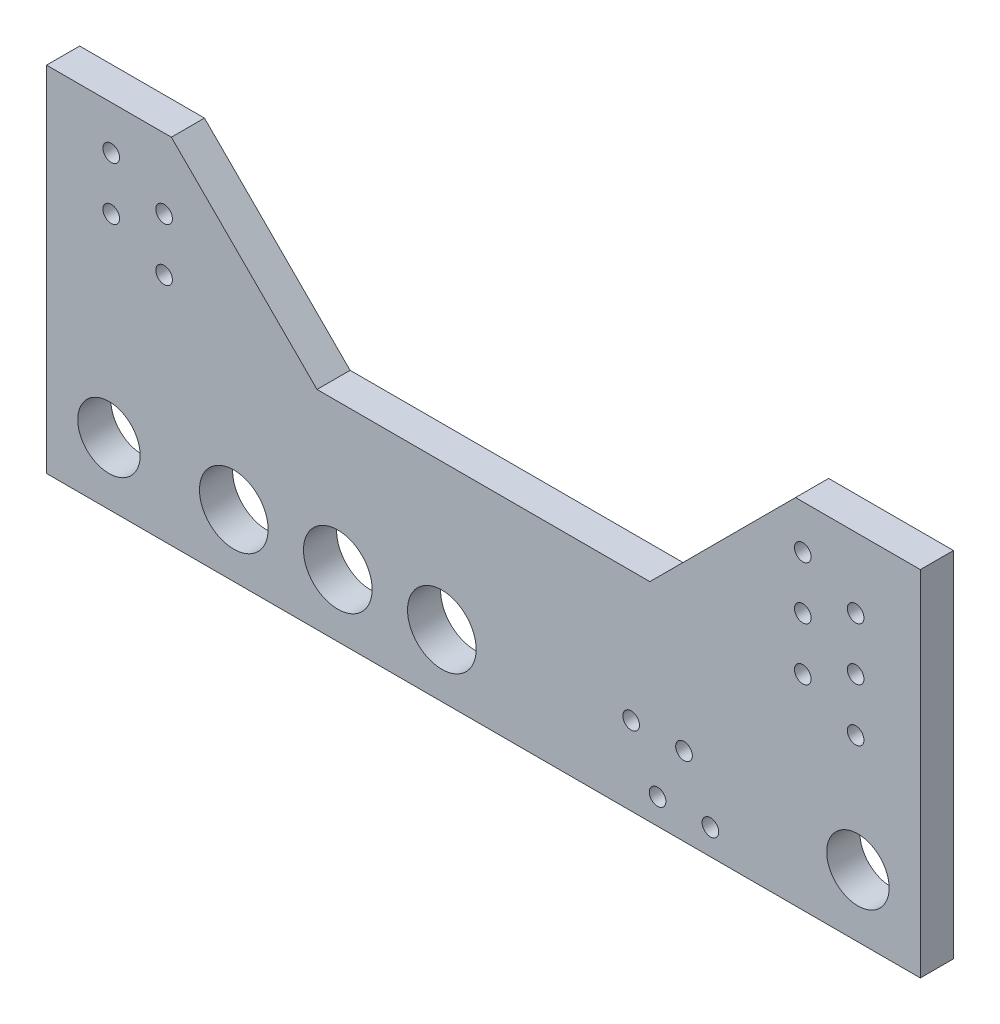
ISO-10303-21;
HEADER;
FILE_DESCRIPTION(('STEP AP214'),'2;1');
FILE_NAME('part.step','',(''),(''),'','','');
FILE_SCHEMA(('AUTOMOTIVE_DESIGN { 1 0 10303 214 1 1 1 1 }'));
ENDSEC;
DATA;
#1=APPLICATION_CONTEXT('core data for automotive mechanical design processes');
#2=APPLICATION_PROTOCOL_DEFINITION('international standard','automotive_design',2000,#1);
#3=PRODUCT_CONTEXT('',#1,'mechanical');
#4=PRODUCT('Part','Part','',(#3));
#5=PRODUCT_RELATED_PRODUCT_CATEGORY('part','',(#4));
#6=PRODUCT_DEFINITION_FORMATION('','',#4);
#7=PRODUCT_DEFINITION_CONTEXT('part definition',#1,'design');
#8=PRODUCT_DEFINITION('design','',#6,#7);
#9=PRODUCT_DEFINITION_SHAPE('','',#8);
#10=(LENGTH_UNIT() NAMED_UNIT(*) SI_UNIT(.MILLI.,.METRE.));
#11=(NAMED_UNIT(*) PLANE_ANGLE_UNIT() SI_UNIT($,.RADIAN.));
#12=(NAMED_UNIT(*) SI_UNIT($,.STERADIAN.) SOLID_ANGLE_UNIT());
#13=UNCERTAINTY_MEASURE_WITH_UNIT(LENGTH_MEASURE(1.E-05),#10,'distance_accuracy_value','');
#14=(GEOMETRIC_REPRESENTATION_CONTEXT(3) GLOBAL_UNCERTAINTY_ASSIGNED_CONTEXT((#13)) GLOBAL_UNIT_ASSIGNED_CONTEXT((#10,
#11,#12)) REPRESENTATION_CONTEXT('',''));
#15=CARTESIAN_POINT('',(0.,0.,0.));
#16=DIRECTION('',(0.,0.,1.));
#17=DIRECTION('',(1.,0.,0.));
#18=AXIS2_PLACEMENT_3D('',#15,#16,#17);
#19=CARTESIAN_POINT('',(0.,0.,-1.59143954));
#20=DIRECTION('',(-1.,0.,0.));
#21=DIRECTION('',(0.,1.,0.));
#22=AXIS2_PLACEMENT_3D('',#19,#20,#21);
#23=PLANE('',#22);
#24=DIRECTION('',(0.,0.,1.));
#25=VECTOR('',#24,1.);
#26=CARTESIAN_POINT('',(0.,0.,-1.59143954));
#27=LINE('',#26,#25);
#28=CARTESIAN_POINT('',(0.,0.,-1.59143954));
#29=VERTEX_POINT('',#28);
#30=CARTESIAN_POINT('',(0.,0.,0.));
#31=VERTEX_POINT('',#30);
#32=EDGE_CURVE('E12',#29,#31,#27,.T.);
#33=ORIENTED_EDGE('',*,*,#32,.T.);
#34=DIRECTION('',(0.,1.,0.));
#35=VECTOR('',#34,1.);
#36=CARTESIAN_POINT('',(0.,0.,0.));
#37=LINE('',#36,#35);
#38=CARTESIAN_POINT('',(0.,17.,0.));
#39=VERTEX_POINT('',#38);
#40=EDGE_CURVE('E27',#31,#39,#37,.T.);
#41=ORIENTED_EDGE('',*,*,#40,.T.);
#42=DIRECTION('',(0.,0.,1.));
#43=VECTOR('',#42,1.);
#44=CARTESIAN_POINT('',(0.,17.,-1.59143954));
#45=LINE('',#44,#43);
#46=CARTESIAN_POINT('',(0.,17.,-1.59143954));
#47=VERTEX_POINT('',#46);
#48=EDGE_CURVE('E317',#47,#39,#45,.T.);
#49=ORIENTED_EDGE('',*,*,#48,.F.);
#50=DIRECTION('',(0.,1.,0.));
#51=VECTOR('',#50,1.);
#52=CARTESIAN_POINT('',(0.,0.,-1.59143954));
#53=LINE('',#52,#51);
#54=EDGE_CURVE('E314',#29,#47,#53,.T.);
#55=ORIENTED_EDGE('',*,*,#54,.F.);
#56=EDGE_LOOP('',(#33,#41,#49,#55));
#57=FACE_BOUND('',#56,.T.);
#58=ADVANCED_FACE('F20',(#57),#23,.T.);
#59=CARTESIAN_POINT('',(0.,17.,-1.59143954));
#60=DIRECTION('',(0.,1.,0.));
#61=DIRECTION('',(1.,0.,0.));
#62=AXIS2_PLACEMENT_3D('',#59,#60,#61);
#63=PLANE('',#62);
#64=ORIENTED_EDGE('',*,*,#48,.T.);
#65=DIRECTION('',(1.,0.,0.));
#66=VECTOR('',#65,1.);
#67=CARTESIAN_POINT('',(0.,17.,0.));
#68=LINE('',#67,#66);
#69=CARTESIAN_POINT('',(6.,17.,0.));
#70=VERTEX_POINT('',#69);
#71=EDGE_CURVE('E312',#39,#70,#68,.T.);
#72=ORIENTED_EDGE('',*,*,#71,.T.);
#73=DIRECTION('',(0.,0.,1.));
#74=VECTOR('',#73,1.);
#75=CARTESIAN_POINT('',(6.,17.,-1.59143954));
#76=LINE('',#75,#74);
#77=CARTESIAN_POINT('',(6.,17.,-1.59143954));
#78=VERTEX_POINT('',#77);
#79=EDGE_CURVE('E309',#78,#70,#76,.T.);
#80=ORIENTED_EDGE('',*,*,#79,.F.);
#81=DIRECTION('',(1.,0.,0.));
#82=VECTOR('',#81,1.);
#83=CARTESIAN_POINT('',(0.,17.,-1.59143954));
#84=LINE('',#83,#82);
#85=EDGE_CURVE('E306',#47,#78,#84,.T.);
#86=ORIENTED_EDGE('',*,*,#85,.F.);
#87=EDGE_LOOP('',(#64,#72,#80,#86));
#88=FACE_BOUND('',#87,.T.);
#89=ADVANCED_FACE('F324',(#88),#63,.T.);
#90=CARTESIAN_POINT('',(6.,17.,-1.59143954));
#91=DIRECTION('',(0.707106781186548,0.707106781186548,0.));
#92=DIRECTION('',(0.707106781186548,-0.707106781186548,0.));
#93=AXIS2_PLACEMENT_3D('',#90,#91,#92);
#94=PLANE('',#93);
#95=ORIENTED_EDGE('',*,*,#79,.T.);
#96=DIRECTION('',(0.707106781186548,-0.707106781186548,0.));
#97=VECTOR('',#96,1.);
#98=CARTESIAN_POINT('',(6.,17.,0.));
#99=LINE('',#98,#97);
#100=CARTESIAN_POINT('',(13.,10.,0.));
#101=VERTEX_POINT('',#100);
#102=EDGE_CURVE('E304',#70,#101,#99,.T.);
#103=ORIENTED_EDGE('',*,*,#102,.T.);
#104=DIRECTION('',(0.,0.,1.));
#105=VECTOR('',#104,1.);
#106=CARTESIAN_POINT('',(13.,10.,-1.59143954));
#107=LINE('',#106,#105);
#108=CARTESIAN_POINT('',(13.,10.,-1.59143954));
#109=VERTEX_POINT('',#108);
#110=EDGE_CURVE('E301',#109,#101,#107,.T.);
#111=ORIENTED_EDGE('',*,*,#110,.F.);
#112=DIRECTION('',(0.707106781186548,-0.707106781186548,0.));
#113=VECTOR('',#112,1.);
#114=CARTESIAN_POINT('',(6.,17.,-1.59143954));
#115=LINE('',#114,#113);
#116=EDGE_CURVE('E298',#78,#109,#115,.T.);
#117=ORIENTED_EDGE('',*,*,#116,.F.);
#118=EDGE_LOOP('',(#95,#103,#111,#117));
#119=FACE_BOUND('',#118,.T.);
#120=ADVANCED_FACE('F331',(#119),#94,.T.);
#121=CARTESIAN_POINT('',(13.,10.,-1.59143954));
#122=DIRECTION('',(0.,1.,0.));
#123=DIRECTION('',(1.,0.,0.));
#124=AXIS2_PLACEMENT_3D('',#121,#122,#123);
#125=PLANE('',#124);
#126=ORIENTED_EDGE('',*,*,#110,.T.);
#127=DIRECTION('',(1.,0.,0.));
#128=VECTOR('',#127,1.);
#129=CARTESIAN_POINT('',(13.,10.,0.));
#130=LINE('',#129,#128);
#131=CARTESIAN_POINT('',(29.,10.,0.));
#132=VERTEX_POINT('',#131);
#133=EDGE_CURVE('E296',#101,#132,#130,.T.);
#134=ORIENTED_EDGE('',*,*,#133,.T.);
#135=DIRECTION('',(0.,0.,1.));
#136=VECTOR('',#135,1.);
#137=CARTESIAN_POINT('',(29.,10.,-1.59143954));
#138=LINE('',#137,#136);
#139=CARTESIAN_POINT('',(29.,10.,-1.59143954));
#140=VERTEX_POINT('',#139);
#141=EDGE_CURVE('E293',#140,#132,#138,.T.);
#142=ORIENTED_EDGE('',*,*,#141,.F.);
#143=DIRECTION('',(1.,0.,0.));
#144=VECTOR('',#143,1.);
#145=CARTESIAN_POINT('',(13.,10.,-1.59143954));
#146=LINE('',#145,#144);
#147=EDGE_CURVE('E290',#109,#140,#146,.T.);
#148=ORIENTED_EDGE('',*,*,#147,.F.);
#149=EDGE_LOOP('',(#126,#134,#142,#148));
#150=FACE_BOUND('',#149,.T.);
#151=ADVANCED_FACE('F335',(#150),#125,.T.);
#152=CARTESIAN_POINT('',(29.,10.,-1.59143954));
#153=DIRECTION('',(-0.707106781186548,0.707106781186548,0.));
#154=DIRECTION('',(0.707106781186548,0.707106781186548,0.));
#155=AXIS2_PLACEMENT_3D('',#152,#153,#154);
#156=PLANE('',#155);
#157=ORIENTED_EDGE('',*,*,#141,.T.);
#158=DIRECTION('',(0.707106781186548,0.707106781186548,0.));
#159=VECTOR('',#158,1.);
#160=CARTESIAN_POINT('',(29.,10.,0.));
#161=LINE('',#160,#159);
#162=CARTESIAN_POINT('',(36.,17.,0.));
#163=VERTEX_POINT('',#162);
#164=EDGE_CURVE('E288',#132,#163,#161,.T.);
#165=ORIENTED_EDGE('',*,*,#164,.T.);
#166=DIRECTION('',(0.,0.,1.));
#167=VECTOR('',#166,1.);
#168=CARTESIAN_POINT('',(36.,17.,-1.59143954));
#169=LINE('',#168,#167);
#170=CARTESIAN_POINT('',(36.,17.,-1.59143954));
#171=VERTEX_POINT('',#170);
#172=EDGE_CURVE('E285',#171,#163,#169,.T.);
#173=ORIENTED_EDGE('',*,*,#172,.F.);
#174=DIRECTION('',(0.707106781186548,0.707106781186548,0.));
#175=VECTOR('',#174,1.);
#176=CARTESIAN_POINT('',(29.,10.,-1.59143954));
#177=LINE('',#176,#175);
#178=EDGE_CURVE('E282',#140,#171,#177,.T.);
#179=ORIENTED_EDGE('',*,*,#178,.F.);
#180=EDGE_LOOP('',(#157,#165,#173,#179));
#181=FACE_BOUND('',#180,.T.);
#182=ADVANCED_FACE('F341',(#181),#156,.T.);
#183=CARTESIAN_POINT('',(36.,17.,-1.59143954));
#184=DIRECTION('',(0.,1.,0.));
#185=DIRECTION('',(1.,0.,0.));
#186=AXIS2_PLACEMENT_3D('',#183,#184,#185);
#187=PLANE('',#186);
#188=ORIENTED_EDGE('',*,*,#172,.T.);
#189=DIRECTION('',(1.,0.,0.));
#190=VECTOR('',#189,1.);
#191=CARTESIAN_POINT('',(36.,17.,0.));
#192=LINE('',#191,#190);
#193=CARTESIAN_POINT('',(42.,17.,0.));
#194=VERTEX_POINT('',#193);
#195=EDGE_CURVE('E280',#163,#194,#192,.T.);
#196=ORIENTED_EDGE('',*,*,#195,.T.);
#197=DIRECTION('',(0.,0.,1.));
#198=VECTOR('',#197,1.);
#199=CARTESIAN_POINT('',(42.,17.,-1.59143954));
#200=LINE('',#199,#198);
#201=CARTESIAN_POINT('',(42.,17.,-1.59143954));
#202=VERTEX_POINT('',#201);
#203=EDGE_CURVE('E277',#202,#194,#200,.T.);
#204=ORIENTED_EDGE('',*,*,#203,.F.);
#205=DIRECTION('',(1.,0.,0.));
#206=VECTOR('',#205,1.);
#207=CARTESIAN_POINT('',(36.,17.,-1.59143954));
#208=LINE('',#207,#206);
#209=EDGE_CURVE('E274',#171,#202,#208,.T.);
#210=ORIENTED_EDGE('',*,*,#209,.F.);
#211=EDGE_LOOP('',(#188,#196,#204,#210));
#212=FACE_BOUND('',#211,.T.);
#213=ADVANCED_FACE('F344',(#212),#187,.T.);
#214=CARTESIAN_POINT('',(42.,17.,-1.59143954));
#215=DIRECTION('',(1.,0.,0.));
#216=DIRECTION('',(0.,-1.,0.));
#217=AXIS2_PLACEMENT_3D('',#214,#215,#216);
#218=PLANE('',#217);
#219=ORIENTED_EDGE('',*,*,#203,.T.);
#220=DIRECTION('',(0.,-1.,0.));
#221=VECTOR('',#220,1.);
#222=CARTESIAN_POINT('',(42.,17.,0.));
#223=LINE('',#222,#221);
#224=CARTESIAN_POINT('',(42.,0.,0.));
#225=VERTEX_POINT('',#224);
#226=EDGE_CURVE('E272',#194,#225,#223,.T.);
#227=ORIENTED_EDGE('',*,*,#226,.T.);
#228=DIRECTION('',(0.,0.,1.));
#229=VECTOR('',#228,1.);
#230=CARTESIAN_POINT('',(42.,0.,-1.59143954));
#231=LINE('',#230,#229);
#232=CARTESIAN_POINT('',(42.,0.,-1.59143954));
#233=VERTEX_POINT('',#232);
#234=EDGE_CURVE('E269',#233,#225,#231,.T.);
#235=ORIENTED_EDGE('',*,*,#234,.F.);
#236=DIRECTION('',(0.,-1.,0.));
#237=VECTOR('',#236,1.);
#238=CARTESIAN_POINT('',(42.,17.,-1.59143954));
#239=LINE('',#238,#237);
#240=EDGE_CURVE('E266',#202,#233,#239,.T.);
#241=ORIENTED_EDGE('',*,*,#240,.F.);
#242=EDGE_LOOP('',(#219,#227,#235,#241));
#243=FACE_BOUND('',#242,.T.);
#244=ADVANCED_FACE('F347',(#243),#218,.T.);
#245=CARTESIAN_POINT('',(42.,0.,-1.59143954));
#246=DIRECTION('',(0.,-1.,0.));
#247=DIRECTION('',(-1.,0.,0.));
#248=AXIS2_PLACEMENT_3D('',#245,#246,#247);
#249=PLANE('',#248);
#250=ORIENTED_EDGE('',*,*,#234,.T.);
#251=DIRECTION('',(-1.,0.,0.));
#252=VECTOR('',#251,1.);
#253=CARTESIAN_POINT('',(42.,0.,0.));
#254=LINE('',#253,#252);
#255=EDGE_CURVE('E264',#225,#31,#254,.T.);
#256=ORIENTED_EDGE('',*,*,#255,.T.);
#257=ORIENTED_EDGE('',*,*,#32,.F.);
#258=DIRECTION('',(-1.,0.,0.));
#259=VECTOR('',#258,1.);
#260=CARTESIAN_POINT('',(42.,0.,-1.59143954));
#261=LINE('',#260,#259);
#262=EDGE_CURVE('E259',#233,#29,#261,.T.);
#263=ORIENTED_EDGE('',*,*,#262,.F.);
#264=EDGE_LOOP('',(#250,#256,#257,#263));
#265=FACE_BOUND('',#264,.T.);
#266=ADVANCED_FACE('F349',(#265),#249,.T.);
#267=CARTESIAN_POINT('',(3.,3.,-1.59143954));
#268=DIRECTION('',(0.,0.,-1.));
#269=DIRECTION('',(1.,0.,0.));
#270=AXIS2_PLACEMENT_3D('',#267,#268,#269);
#271=CYLINDRICAL_SURFACE('',#270,1.5);
#272=DIRECTION('',(0.,0.,1.));
#273=VECTOR('',#272,1.);
#274=CARTESIAN_POINT('',(4.5,3.,-1.59143954));
#275=LINE('',#274,#273);
#276=CARTESIAN_POINT('',(4.5,3.,-1.59143954));
#277=VERTEX_POINT('',#276);
#278=CARTESIAN_POINT('',(4.5,3.,0.));
#279=VERTEX_POINT('',#278);
#280=EDGE_CURVE('E258',#277,#279,#275,.T.);
#281=ORIENTED_EDGE('',*,*,#280,.T.);
#282=CARTESIAN_POINT('',(3.,3.,0.));
#283=DIRECTION('',(0.,0.,1.));
#284=DIRECTION('',(1.,0.,0.));
#285=AXIS2_PLACEMENT_3D('',#282,#283,#284);
#286=CIRCLE('',#285,1.5);
#287=EDGE_CURVE('E253',#279,#279,#286,.T.);
#288=ORIENTED_EDGE('',*,*,#287,.T.);
#289=ORIENTED_EDGE('',*,*,#280,.F.);
#290=CARTESIAN_POINT('',(3.,3.,-1.59143954));
#291=DIRECTION('',(0.,0.,1.));
#292=DIRECTION('',(1.,0.,0.));
#293=AXIS2_PLACEMENT_3D('',#290,#291,#292);
#294=CIRCLE('',#293,1.5);
#295=EDGE_CURVE('E248',#277,#277,#294,.T.);
#296=ORIENTED_EDGE('',*,*,#295,.F.);
#297=EDGE_LOOP('',(#281,#288,#289,#296));
#298=FACE_BOUND('',#297,.T.);
#299=ADVANCED_FACE('F351',(#298),#271,.F.);
#300=CARTESIAN_POINT('',(8.99999978,2.99999908,-1.59143954));
#301=DIRECTION('',(0.,0.,-1.));
#302=DIRECTION('',(1.,0.,0.));
#303=AXIS2_PLACEMENT_3D('',#300,#301,#302);
#304=CYLINDRICAL_SURFACE('',#303,1.64999924);
#305=DIRECTION('',(0.,0.,1.));
#306=VECTOR('',#305,1.);
#307=CARTESIAN_POINT('',(10.64999902,2.99999908,-1.59143954));
#308=LINE('',#307,#306);
#309=CARTESIAN_POINT('',(10.64999902,2.99999908,-1.59143954));
#310=VERTEX_POINT('',#309);
#311=CARTESIAN_POINT('',(10.64999902,2.99999908,0.));
#312=VERTEX_POINT('',#311);
#313=EDGE_CURVE('E254',#310,#312,#308,.T.);
#314=ORIENTED_EDGE('',*,*,#313,.T.);
#315=CARTESIAN_POINT('',(8.99999978,2.99999908,0.));
#316=DIRECTION('',(0.,0.,1.));
#317=DIRECTION('',(1.,0.,0.));
#318=AXIS2_PLACEMENT_3D('',#315,#316,#317);
#319=CIRCLE('',#318,1.64999924);
#320=EDGE_CURVE('E704',#312,#312,#319,.T.);
#321=ORIENTED_EDGE('',*,*,#320,.T.);
#322=ORIENTED_EDGE('',*,*,#313,.F.);
#323=CARTESIAN_POINT('',(8.99999978,2.99999908,-1.59143954));
#324=DIRECTION('',(0.,0.,1.));
#325=DIRECTION('',(1.,0.,0.));
#326=AXIS2_PLACEMENT_3D('',#323,#324,#325);
#327=CIRCLE('',#326,1.64999924);
#328=EDGE_CURVE('E703',#310,#310,#327,.T.);
#329=ORIENTED_EDGE('',*,*,#328,.F.);
#330=EDGE_LOOP('',(#314,#321,#322,#329));
#331=FACE_BOUND('',#330,.T.);
#332=ADVANCED_FACE('F358',(#331),#304,.F.);
#333=CARTESIAN_POINT('',(19.0000001,2.99999908,-1.59143954));
#334=DIRECTION('',(0.,0.,-1.));
#335=DIRECTION('',(1.,0.,0.));
#336=AXIS2_PLACEMENT_3D('',#333,#334,#335);
#337=CYLINDRICAL_SURFACE('',#336,1.64999924);
#338=DIRECTION('',(0.,0.,1.));
#339=VECTOR('',#338,1.);
#340=CARTESIAN_POINT('',(20.64999934,2.99999908,-1.59143954));
#341=LINE('',#340,#339);
#342=CARTESIAN_POINT('',(20.64999934,2.99999908,-1.59143954));
#343=VERTEX_POINT('',#342);
#344=CARTESIAN_POINT('',(20.64999934,2.99999908,0.));
#345=VERTEX_POINT('',#344);
#346=EDGE_CURVE('E701',#343,#345,#341,.T.);
#347=ORIENTED_EDGE('',*,*,#346,.T.);
#348=CARTESIAN_POINT('',(19.0000001,2.99999908,0.));
#349=DIRECTION('',(0.,0.,1.));
#350=DIRECTION('',(1.,0.,0.));
#351=AXIS2_PLACEMENT_3D('',#348,#349,#350);
#352=CIRCLE('',#351,1.64999924);
#353=EDGE_CURVE('E698',#345,#345,#352,.T.);
#354=ORIENTED_EDGE('',*,*,#353,.T.);
#355=ORIENTED_EDGE('',*,*,#346,.F.);
#356=CARTESIAN_POINT('',(19.0000001,2.99999908,-1.59143954));
#357=DIRECTION('',(0.,0.,1.));
#358=DIRECTION('',(1.,0.,0.));
#359=AXIS2_PLACEMENT_3D('',#356,#357,#358);
#360=CIRCLE('',#359,1.64999924);
#361=EDGE_CURVE('E696',#343,#343,#360,.T.);
#362=ORIENTED_EDGE('',*,*,#361,.F.);
#363=EDGE_LOOP('',(#347,#354,#355,#362));
#364=FACE_BOUND('',#363,.T.);
#365=ADVANCED_FACE('F411',(#364),#337,.F.);
#366=CARTESIAN_POINT('',(13.99999994,2.99999908,-1.59143954));
#367=DIRECTION('',(0.,0.,-1.));
#368=DIRECTION('',(1.,0.,0.));
#369=AXIS2_PLACEMENT_3D('',#366,#367,#368);
#370=CYLINDRICAL_SURFACE('',#369,1.64999924);
#371=DIRECTION('',(0.,0.,1.));
#372=VECTOR('',#371,1.);
#373=CARTESIAN_POINT('',(15.64999918,2.99999908,-1.59143954));
#374=LINE('',#373,#372);
#375=CARTESIAN_POINT('',(15.64999918,2.99999908,-1.59143954));
#376=VERTEX_POINT('',#375);
#377=CARTESIAN_POINT('',(15.64999918,2.99999908,0.));
#378=VERTEX_POINT('',#377);
#379=EDGE_CURVE('E694',#376,#378,#374,.T.);
#380=ORIENTED_EDGE('',*,*,#379,.T.);
#381=CARTESIAN_POINT('',(13.99999994,2.99999908,0.));
#382=DIRECTION('',(0.,0.,1.));
#383=DIRECTION('',(1.,0.,0.));
#384=AXIS2_PLACEMENT_3D('',#381,#382,#383);
#385=CIRCLE('',#384,1.64999924);
#386=EDGE_CURVE('E691',#378,#378,#385,.T.);
#387=ORIENTED_EDGE('',*,*,#386,.T.);
#388=ORIENTED_EDGE('',*,*,#379,.F.);
#389=CARTESIAN_POINT('',(13.99999994,2.99999908,-1.59143954));
#390=DIRECTION('',(0.,0.,1.));
#391=DIRECTION('',(1.,0.,0.));
#392=AXIS2_PLACEMENT_3D('',#389,#390,#391);
#393=CIRCLE('',#392,1.64999924);
#394=EDGE_CURVE('E689',#376,#376,#393,.T.);
#395=ORIENTED_EDGE('',*,*,#394,.F.);
#396=EDGE_LOOP('',(#380,#387,#388,#395));
#397=FACE_BOUND('',#396,.T.);
#398=ADVANCED_FACE('F421',(#397),#370,.F.);
#399=CARTESIAN_POINT('',(3.10999886,12.36000068,-1.59143954));
#400=DIRECTION('',(0.,0.,-1.));
#401=DIRECTION('',(1.,0.,0.));
#402=AXIS2_PLACEMENT_3D('',#399,#400,#401);
#403=CYLINDRICAL_SURFACE('',#402,0.3999992);
#404=DIRECTION('',(0.,0.,1.));
#405=VECTOR('',#404,1.);
#406=CARTESIAN_POINT('',(3.50999806,12.36000068,-1.59143954));
#407=LINE('',#406,#405);
#408=CARTESIAN_POINT('',(3.50999806,12.36000068,-1.59143954));
#409=VERTEX_POINT('',#408);
#410=CARTESIAN_POINT('',(3.50999806,12.36000068,0.));
#411=VERTEX_POINT('',#410);
#412=EDGE_CURVE('E687',#409,#411,#407,.T.);
#413=ORIENTED_EDGE('',*,*,#412,.T.);
#414=CARTESIAN_POINT('',(3.10999886,12.36000068,0.));
#415=DIRECTION('',(0.,0.,1.));
#416=DIRECTION('',(1.,0.,0.));
#417=AXIS2_PLACEMENT_3D('',#414,#415,#416);
#418=CIRCLE('',#417,0.3999992);
#419=EDGE_CURVE('E684',#411,#411,#418,.T.);
#420=ORIENTED_EDGE('',*,*,#419,.T.);
#421=ORIENTED_EDGE('',*,*,#412,.F.);
#422=CARTESIAN_POINT('',(3.10999886,12.36000068,-1.59143954));
#423=DIRECTION('',(0.,0.,1.));
#424=DIRECTION('',(1.,0.,0.));
#425=AXIS2_PLACEMENT_3D('',#422,#423,#424);
#426=CIRCLE('',#425,0.3999992);
#427=EDGE_CURVE('E682',#409,#409,#426,.T.);
#428=ORIENTED_EDGE('',*,*,#427,.F.);
#429=EDGE_LOOP('',(#413,#420,#421,#428));
#430=FACE_BOUND('',#429,.T.);
#431=ADVANCED_FACE('F431',(#430),#403,.F.);
#432=CARTESIAN_POINT('',(3.10999886,14.90000068,-1.59143954));
#433=DIRECTION('',(0.,0.,-1.));
#434=DIRECTION('',(1.,0.,0.));
#435=AXIS2_PLACEMENT_3D('',#432,#433,#434);
#436=CYLINDRICAL_SURFACE('',#435,0.3999992);
#437=DIRECTION('',(0.,0.,1.));
#438=VECTOR('',#437,1.);
#439=CARTESIAN_POINT('',(3.50999806,14.90000068,-1.59143954));
#440=LINE('',#439,#438);
#441=CARTESIAN_POINT('',(3.50999806,14.90000068,-1.59143954));
#442=VERTEX_POINT('',#441);
#443=CARTESIAN_POINT('',(3.50999806,14.90000068,0.));
#444=VERTEX_POINT('',#443);
#445=EDGE_CURVE('E680',#442,#444,#440,.T.);
#446=ORIENTED_EDGE('',*,*,#445,.T.);
#447=CARTESIAN_POINT('',(3.10999886,14.90000068,0.));
#448=DIRECTION('',(0.,0.,1.));
#449=DIRECTION('',(1.,0.,0.));
#450=AXIS2_PLACEMENT_3D('',#447,#448,#449);
#451=CIRCLE('',#450,0.3999992);
#452=EDGE_CURVE('E677',#444,#444,#451,.T.);
#453=ORIENTED_EDGE('',*,*,#452,.T.);
#454=ORIENTED_EDGE('',*,*,#445,.F.);
#455=CARTESIAN_POINT('',(3.10999886,14.90000068,-1.59143954));
#456=DIRECTION('',(0.,0.,1.));
#457=DIRECTION('',(1.,0.,0.));
#458=AXIS2_PLACEMENT_3D('',#455,#456,#457);
#459=CIRCLE('',#458,0.3999992);
#460=EDGE_CURVE('E675',#442,#442,#459,.T.);
#461=ORIENTED_EDGE('',*,*,#460,.F.);
#462=EDGE_LOOP('',(#446,#453,#454,#461));
#463=FACE_BOUND('',#462,.T.);
#464=ADVANCED_FACE('F441',(#463),#436,.F.);
#465=CARTESIAN_POINT('',(28.09999968,3.77000008,-1.59143954));
#466=DIRECTION('',(0.,0.,-1.));
#467=DIRECTION('',(1.,0.,0.));
#468=AXIS2_PLACEMENT_3D('',#465,#466,#467);
#469=CYLINDRICAL_SURFACE('',#468,0.3999992);
#470=DIRECTION('',(0.,0.,1.));
#471=VECTOR('',#470,1.);
#472=CARTESIAN_POINT('',(28.49999888,3.77000008,-1.59143954));
#473=LINE('',#472,#471);
#474=CARTESIAN_POINT('',(28.49999888,3.77000008,-1.59143954));
#475=VERTEX_POINT('',#474);
#476=CARTESIAN_POINT('',(28.49999888,3.77000008,0.));
#477=VERTEX_POINT('',#476);
#478=EDGE_CURVE('E673',#475,#477,#473,.T.);
#479=ORIENTED_EDGE('',*,*,#478,.T.);
#480=CARTESIAN_POINT('',(28.09999968,3.77000008,0.));
#481=DIRECTION('',(0.,0.,1.));
#482=DIRECTION('',(1.,0.,0.));
#483=AXIS2_PLACEMENT_3D('',#480,#481,#482);
#484=CIRCLE('',#483,0.3999992);
#485=EDGE_CURVE('E670',#477,#477,#484,.T.);
#486=ORIENTED_EDGE('',*,*,#485,.T.);
#487=ORIENTED_EDGE('',*,*,#478,.F.);
#488=CARTESIAN_POINT('',(28.09999968,3.77000008,-1.59143954));
#489=DIRECTION('',(0.,0.,1.));
#490=DIRECTION('',(1.,0.,0.));
#491=AXIS2_PLACEMENT_3D('',#488,#489,#490);
#492=CIRCLE('',#491,0.3999992);
#493=EDGE_CURVE('E668',#475,#475,#492,.T.);
#494=ORIENTED_EDGE('',*,*,#493,.F.);
#495=EDGE_LOOP('',(#479,#486,#487,#494));
#496=FACE_BOUND('',#495,.T.);
#497=ADVANCED_FACE('F451',(#496),#469,.F.);
#498=CARTESIAN_POINT('',(5.64999886,13.63000068,-1.59143954));
#499=DIRECTION('',(0.,0.,-1.));
#500=DIRECTION('',(1.,0.,0.));
#501=AXIS2_PLACEMENT_3D('',#498,#499,#500);
#502=CYLINDRICAL_SURFACE('',#501,0.3999992);
#503=DIRECTION('',(0.,0.,1.));
#504=VECTOR('',#503,1.);
#505=CARTESIAN_POINT('',(6.04999806,13.63000068,-1.59143954));
#506=LINE('',#505,#504);
#507=CARTESIAN_POINT('',(6.04999806,13.63000068,-1.59143954));
#508=VERTEX_POINT('',#507);
#509=CARTESIAN_POINT('',(6.04999806,13.63000068,0.));
#510=VERTEX_POINT('',#509);
#511=EDGE_CURVE('E666',#508,#510,#506,.T.);
#512=ORIENTED_EDGE('',*,*,#511,.T.);
#513=CARTESIAN_POINT('',(5.64999886,13.63000068,0.));
#514=DIRECTION('',(0.,0.,1.));
#515=DIRECTION('',(1.,0.,0.));
#516=AXIS2_PLACEMENT_3D('',#513,#514,#515);
#517=CIRCLE('',#516,0.3999992);
#518=EDGE_CURVE('E663',#510,#510,#517,.T.);
#519=ORIENTED_EDGE('',*,*,#518,.T.);
#520=ORIENTED_EDGE('',*,*,#511,.F.);
#521=CARTESIAN_POINT('',(5.64999886,13.63000068,-1.59143954));
#522=DIRECTION('',(0.,0.,1.));
#523=DIRECTION('',(1.,0.,0.));
#524=AXIS2_PLACEMENT_3D('',#521,#522,#523);
#525=CIRCLE('',#524,0.3999992);
#526=EDGE_CURVE('E661',#508,#508,#525,.T.);
#527=ORIENTED_EDGE('',*,*,#526,.F.);
#528=EDGE_LOOP('',(#512,#519,#520,#527));
#529=FACE_BOUND('',#528,.T.);
#530=ADVANCED_FACE('F461',(#529),#502,.F.);
#531=CARTESIAN_POINT('',(5.64999886,11.09000068,-1.59143954));
#532=DIRECTION('',(0.,0.,-1.));
#533=DIRECTION('',(1.,0.,0.));
#534=AXIS2_PLACEMENT_3D('',#531,#532,#533);
#535=CYLINDRICAL_SURFACE('',#534,0.3999992);
#536=DIRECTION('',(0.,0.,1.));
#537=VECTOR('',#536,1.);
#538=CARTESIAN_POINT('',(6.04999806,11.09000068,-1.59143954));
#539=LINE('',#538,#537);
#540=CARTESIAN_POINT('',(6.04999806,11.09000068,-1.59143954));
#541=VERTEX_POINT('',#540);
#542=CARTESIAN_POINT('',(6.04999806,11.09000068,0.));
#543=VERTEX_POINT('',#542);
#544=EDGE_CURVE('E659',#541,#543,#539,.T.);
#545=ORIENTED_EDGE('',*,*,#544,.T.);
#546=CARTESIAN_POINT('',(5.64999886,11.09000068,0.));
#547=DIRECTION('',(0.,0.,1.));
#548=DIRECTION('',(1.,0.,0.));
#549=AXIS2_PLACEMENT_3D('',#546,#547,#548);
#550=CIRCLE('',#549,0.3999992);
#551=EDGE_CURVE('E656',#543,#543,#550,.T.);
#552=ORIENTED_EDGE('',*,*,#551,.T.);
#553=ORIENTED_EDGE('',*,*,#544,.F.);
#554=CARTESIAN_POINT('',(5.64999886,11.09000068,-1.59143954));
#555=DIRECTION('',(0.,0.,1.));
#556=DIRECTION('',(1.,0.,0.));
#557=AXIS2_PLACEMENT_3D('',#554,#555,#556);
#558=CIRCLE('',#557,0.3999992);
#559=EDGE_CURVE('E654',#541,#541,#558,.T.);
#560=ORIENTED_EDGE('',*,*,#559,.F.);
#561=EDGE_LOOP('',(#545,#552,#553,#560));
#562=FACE_BOUND('',#561,.T.);
#563=ADVANCED_FACE('F471',(#562),#535,.F.);
#564=CARTESIAN_POINT('',(29.36999968,1.23000008,-1.59143954));
#565=DIRECTION('',(0.,0.,-1.));
#566=DIRECTION('',(1.,0.,0.));
#567=AXIS2_PLACEMENT_3D('',#564,#565,#566);
#568=CYLINDRICAL_SURFACE('',#567,0.3999992);
#569=DIRECTION('',(0.,0.,1.));
#570=VECTOR('',#569,1.);
#571=CARTESIAN_POINT('',(29.76999888,1.23000008,-1.59143954));
#572=LINE('',#571,#570);
#573=CARTESIAN_POINT('',(29.76999888,1.23000008,-1.59143954));
#574=VERTEX_POINT('',#573);
#575=CARTESIAN_POINT('',(29.76999888,1.23000008,0.));
#576=VERTEX_POINT('',#575);
#577=EDGE_CURVE('E652',#574,#576,#572,.T.);
#578=ORIENTED_EDGE('',*,*,#577,.T.);
#579=CARTESIAN_POINT('',(29.36999968,1.23000008,0.));
#580=DIRECTION('',(0.,0.,1.));
#581=DIRECTION('',(1.,0.,0.));
#582=AXIS2_PLACEMENT_3D('',#579,#580,#581);
#583=CIRCLE('',#582,0.3999992);
#584=EDGE_CURVE('E649',#576,#576,#583,.T.);
#585=ORIENTED_EDGE('',*,*,#584,.T.);
#586=ORIENTED_EDGE('',*,*,#577,.F.);
#587=CARTESIAN_POINT('',(29.36999968,1.23000008,-1.59143954));
#588=DIRECTION('',(0.,0.,1.));
#589=DIRECTION('',(1.,0.,0.));
#590=AXIS2_PLACEMENT_3D('',#587,#588,#589);
#591=CIRCLE('',#590,0.3999992);
#592=EDGE_CURVE('E647',#574,#574,#591,.T.);
#593=ORIENTED_EDGE('',*,*,#592,.F.);
#594=EDGE_LOOP('',(#578,#585,#586,#593));
#595=FACE_BOUND('',#594,.T.);
#596=ADVANCED_FACE('F481',(#595),#568,.F.);
#597=CARTESIAN_POINT('',(30.63999968,3.77000008,-1.59143954));
#598=DIRECTION('',(0.,0.,-1.));
#599=DIRECTION('',(1.,0.,0.));
#600=AXIS2_PLACEMENT_3D('',#597,#598,#599);
#601=CYLINDRICAL_SURFACE('',#600,0.3999992);
#602=DIRECTION('',(0.,0.,1.));
#603=VECTOR('',#602,1.);
#604=CARTESIAN_POINT('',(31.03999888,3.77000008,-1.59143954));
#605=LINE('',#604,#603);
#606=CARTESIAN_POINT('',(31.03999888,3.77000008,-1.59143954));
#607=VERTEX_POINT('',#606);
#608=CARTESIAN_POINT('',(31.03999888,3.77000008,0.));
#609=VERTEX_POINT('',#608);
#610=EDGE_CURVE('E645',#607,#609,#605,.T.);
#611=ORIENTED_EDGE('',*,*,#610,.T.);
#612=CARTESIAN_POINT('',(30.63999968,3.77000008,0.));
#613=DIRECTION('',(0.,0.,1.));
#614=DIRECTION('',(1.,0.,0.));
#615=AXIS2_PLACEMENT_3D('',#612,#613,#614);
#616=CIRCLE('',#615,0.3999992);
#617=EDGE_CURVE('E642',#609,#609,#616,.T.);
#618=ORIENTED_EDGE('',*,*,#617,.T.);
#619=ORIENTED_EDGE('',*,*,#610,.F.);
#620=CARTESIAN_POINT('',(30.63999968,3.77000008,-1.59143954));
#621=DIRECTION('',(0.,0.,1.));
#622=DIRECTION('',(1.,0.,0.));
#623=AXIS2_PLACEMENT_3D('',#620,#621,#622);
#624=CIRCLE('',#623,0.3999992);
#625=EDGE_CURVE('E640',#607,#607,#624,.T.);
#626=ORIENTED_EDGE('',*,*,#625,.F.);
#627=EDGE_LOOP('',(#611,#618,#619,#626));
#628=FACE_BOUND('',#627,.T.);
#629=ADVANCED_FACE('F491',(#628),#601,.F.);
#630=CARTESIAN_POINT('',(31.90999968,1.23000008,-1.59143954));
#631=DIRECTION('',(0.,0.,-1.));
#632=DIRECTION('',(1.,0.,0.));
#633=AXIS2_PLACEMENT_3D('',#630,#631,#632);
#634=CYLINDRICAL_SURFACE('',#633,0.3999992);
#635=DIRECTION('',(0.,0.,1.));
#636=VECTOR('',#635,1.);
#637=CARTESIAN_POINT('',(32.30999888,1.23000008,-1.59143954));
#638=LINE('',#637,#636);
#639=CARTESIAN_POINT('',(32.30999888,1.23000008,-1.59143954));
#640=VERTEX_POINT('',#639);
#641=CARTESIAN_POINT('',(32.30999888,1.23000008,0.));
#642=VERTEX_POINT('',#641);
#643=EDGE_CURVE('E638',#640,#642,#638,.T.);
#644=ORIENTED_EDGE('',*,*,#643,.T.);
#645=CARTESIAN_POINT('',(31.90999968,1.23000008,0.));
#646=DIRECTION('',(0.,0.,1.));
#647=DIRECTION('',(1.,0.,0.));
#648=AXIS2_PLACEMENT_3D('',#645,#646,#647);
#649=CIRCLE('',#648,0.3999992);
#650=EDGE_CURVE('E633',#642,#642,#649,.T.);
#651=ORIENTED_EDGE('',*,*,#650,.T.);
#652=ORIENTED_EDGE('',*,*,#643,.F.);
#653=CARTESIAN_POINT('',(31.90999968,1.23000008,-1.59143954));
#654=DIRECTION('',(0.,0.,1.));
#655=DIRECTION('',(1.,0.,0.));
#656=AXIS2_PLACEMENT_3D('',#653,#654,#655);
#657=CIRCLE('',#656,0.3999992);
#658=EDGE_CURVE('E632',#640,#640,#657,.T.);
#659=ORIENTED_EDGE('',*,*,#658,.F.);
#660=EDGE_LOOP('',(#644,#651,#652,#659));
#661=FACE_BOUND('',#660,.T.);
#662=ADVANCED_FACE('F501',(#661),#634,.F.);
#663=CARTESIAN_POINT('',(39.,3.,-1.59143954));
#664=DIRECTION('',(0.,0.,-1.));
#665=DIRECTION('',(1.,0.,0.));
#666=AXIS2_PLACEMENT_3D('',#663,#664,#665);
#667=CYLINDRICAL_SURFACE('',#666,1.5);
#668=DIRECTION('',(0.,0.,1.));
#669=VECTOR('',#668,1.);
#670=CARTESIAN_POINT('',(40.5,3.,-1.59143954));
#671=LINE('',#670,#669);
#672=CARTESIAN_POINT('',(40.5,3.,-1.59143954));
#673=VERTEX_POINT('',#672);
#674=CARTESIAN_POINT('',(40.5,3.,0.));
#675=VERTEX_POINT('',#674);
#676=EDGE_CURVE('E630',#673,#675,#671,.T.);
#677=ORIENTED_EDGE('',*,*,#676,.T.);
#678=CARTESIAN_POINT('',(39.,3.,0.));
#679=DIRECTION('',(0.,0.,1.));
#680=DIRECTION('',(1.,0.,0.));
#681=AXIS2_PLACEMENT_3D('',#678,#679,#680);
#682=CIRCLE('',#681,1.5);
#683=EDGE_CURVE('E244',#675,#675,#682,.T.);
#684=ORIENTED_EDGE('',*,*,#683,.T.);
#685=ORIENTED_EDGE('',*,*,#676,.F.);
#686=CARTESIAN_POINT('',(39.,3.,-1.59143954));
#687=DIRECTION('',(0.,0.,1.));
#688=DIRECTION('',(1.,0.,0.));
#689=AXIS2_PLACEMENT_3D('',#686,#687,#688);
#690=CIRCLE('',#689,1.5);
#691=EDGE_CURVE('E240',#673,#673,#690,.T.);
#692=ORIENTED_EDGE('',*,*,#691,.F.);
#693=EDGE_LOOP('',(#677,#684,#685,#692));
#694=FACE_BOUND('',#693,.T.);
#695=ADVANCED_FACE('F511',(#694),#667,.F.);
#696=CARTESIAN_POINT('',(38.89000096,8.55000068,-1.59143954));
#697=DIRECTION('',(0.,0.,-1.));
#698=DIRECTION('',(1.,0.,0.));
#699=AXIS2_PLACEMENT_3D('',#696,#697,#698);
#700=CYLINDRICAL_SURFACE('',#699,0.3999992);
#701=DIRECTION('',(0.,0.,1.));
#702=VECTOR('',#701,1.);
#703=CARTESIAN_POINT('',(39.29000016,8.55000068,-1.59143954));
#704=LINE('',#703,#702);
#705=CARTESIAN_POINT('',(39.29000016,8.55000068,-1.59143954));
#706=VERTEX_POINT('',#705);
#707=CARTESIAN_POINT('',(39.29000016,8.55000068,0.));
#708=VERTEX_POINT('',#707);
#709=EDGE_CURVE('E238',#706,#708,#704,.T.);
#710=ORIENTED_EDGE('',*,*,#709,.T.);
#711=CARTESIAN_POINT('',(38.89000096,8.55000068,0.));
#712=DIRECTION('',(0.,0.,1.));
#713=DIRECTION('',(1.,0.,0.));
#714=AXIS2_PLACEMENT_3D('',#711,#712,#713);
#715=CIRCLE('',#714,0.3999992);
#716=EDGE_CURVE('E235',#708,#708,#715,.T.);
#717=ORIENTED_EDGE('',*,*,#716,.T.);
#718=ORIENTED_EDGE('',*,*,#709,.F.);
#719=CARTESIAN_POINT('',(38.89000096,8.55000068,-1.59143954));
#720=DIRECTION('',(0.,0.,1.));
#721=DIRECTION('',(1.,0.,0.));
#722=AXIS2_PLACEMENT_3D('',#719,#720,#721);
#723=CIRCLE('',#722,0.3999992);
#724=EDGE_CURVE('E233',#706,#706,#723,.T.);
#725=ORIENTED_EDGE('',*,*,#724,.F.);
#726=EDGE_LOOP('',(#710,#717,#718,#725));
#727=FACE_BOUND('',#726,.T.);
#728=ADVANCED_FACE('F521',(#727),#700,.F.);
#729=CARTESIAN_POINT('',(36.35000096,9.82000068,-1.59143954));
#730=DIRECTION('',(0.,0.,-1.));
#731=DIRECTION('',(1.,0.,0.));
#732=AXIS2_PLACEMENT_3D('',#729,#730,#731);
#733=CYLINDRICAL_SURFACE('',#732,0.3999992);
#734=DIRECTION('',(0.,0.,1.));
#735=VECTOR('',#734,1.);
#736=CARTESIAN_POINT('',(36.75000016,9.82000068,-1.59143954));
#737=LINE('',#736,#735);
#738=CARTESIAN_POINT('',(36.75000016,9.82000068,-1.59143954));
#739=VERTEX_POINT('',#738);
#740=CARTESIAN_POINT('',(36.75000016,9.82000068,0.));
#741=VERTEX_POINT('',#740);
#742=EDGE_CURVE('E231',#739,#741,#737,.T.);
#743=ORIENTED_EDGE('',*,*,#742,.T.);
#744=CARTESIAN_POINT('',(36.35000096,9.82000068,0.));
#745=DIRECTION('',(0.,0.,1.));
#746=DIRECTION('',(1.,0.,0.));
#747=AXIS2_PLACEMENT_3D('',#744,#745,#746);
#748=CIRCLE('',#747,0.3999992);
#749=EDGE_CURVE('E228',#741,#741,#748,.T.);
#750=ORIENTED_EDGE('',*,*,#749,.T.);
#751=ORIENTED_EDGE('',*,*,#742,.F.);
#752=CARTESIAN_POINT('',(36.35000096,9.82000068,-1.59143954));
#753=DIRECTION('',(0.,0.,1.));
#754=DIRECTION('',(1.,0.,0.));
#755=AXIS2_PLACEMENT_3D('',#752,#753,#754);
#756=CIRCLE('',#755,0.3999992);
#757=EDGE_CURVE('E226',#739,#739,#756,.T.);
#758=ORIENTED_EDGE('',*,*,#757,.F.);
#759=EDGE_LOOP('',(#743,#750,#751,#758));
#760=FACE_BOUND('',#759,.T.);
#761=ADVANCED_FACE('F531',(#760),#733,.F.);
#762=CARTESIAN_POINT('',(36.35000096,12.36000068,-1.59143954));
#763=DIRECTION('',(0.,0.,-1.));
#764=DIRECTION('',(1.,0.,0.));
#765=AXIS2_PLACEMENT_3D('',#762,#763,#764);
#766=CYLINDRICAL_SURFACE('',#765,0.3999992);
#767=DIRECTION('',(0.,0.,1.));
#768=VECTOR('',#767,1.);
#769=CARTESIAN_POINT('',(36.75000016,12.36000068,-1.59143954));
#770=LINE('',#769,#768);
#771=CARTESIAN_POINT('',(36.75000016,12.36000068,-1.59143954));
#772=VERTEX_POINT('',#771);
#773=CARTESIAN_POINT('',(36.75000016,12.36000068,0.));
#774=VERTEX_POINT('',#773);
#775=EDGE_CURVE('E224',#772,#774,#770,.T.);
#776=ORIENTED_EDGE('',*,*,#775,.T.);
#777=CARTESIAN_POINT('',(36.35000096,12.36000068,0.));
#778=DIRECTION('',(0.,0.,1.));
#779=DIRECTION('',(1.,0.,0.));
#780=AXIS2_PLACEMENT_3D('',#777,#778,#779);
#781=CIRCLE('',#780,0.3999992);
#782=EDGE_CURVE('E221',#774,#774,#781,.T.);
#783=ORIENTED_EDGE('',*,*,#782,.T.);
#784=ORIENTED_EDGE('',*,*,#775,.F.);
#785=CARTESIAN_POINT('',(36.35000096,12.36000068,-1.59143954));
#786=DIRECTION('',(0.,0.,1.));
#787=DIRECTION('',(1.,0.,0.));
#788=AXIS2_PLACEMENT_3D('',#785,#786,#787);
#789=CIRCLE('',#788,0.3999992);
#790=EDGE_CURVE('E219',#772,#772,#789,.T.);
#791=ORIENTED_EDGE('',*,*,#790,.F.);
#792=EDGE_LOOP('',(#776,#783,#784,#791));
#793=FACE_BOUND('',#792,.T.);
#794=ADVANCED_FACE('F541',(#793),#766,.F.);
#795=CARTESIAN_POINT('',(38.89000096,11.09000068,-1.59143954));
#796=DIRECTION('',(0.,0.,-1.));
#797=DIRECTION('',(1.,0.,0.));
#798=AXIS2_PLACEMENT_3D('',#795,#796,#797);
#799=CYLINDRICAL_SURFACE('',#798,0.3999992);
#800=DIRECTION('',(0.,0.,1.));
#801=VECTOR('',#800,1.);
#802=CARTESIAN_POINT('',(39.29000016,11.09000068,-1.59143954));
#803=LINE('',#802,#801);
#804=CARTESIAN_POINT('',(39.29000016,11.09000068,-1.59143954));
#805=VERTEX_POINT('',#804);
#806=CARTESIAN_POINT('',(39.29000016,11.09000068,0.));
#807=VERTEX_POINT('',#806);
#808=EDGE_CURVE('E217',#805,#807,#803,.T.);
#809=ORIENTED_EDGE('',*,*,#808,.T.);
#810=CARTESIAN_POINT('',(38.89000096,11.09000068,0.));
#811=DIRECTION('',(0.,0.,1.));
#812=DIRECTION('',(1.,0.,0.));
#813=AXIS2_PLACEMENT_3D('',#810,#811,#812);
#814=CIRCLE('',#813,0.3999992);
#815=EDGE_CURVE('E214',#807,#807,#814,.T.);
#816=ORIENTED_EDGE('',*,*,#815,.T.);
#817=ORIENTED_EDGE('',*,*,#808,.F.);
#818=CARTESIAN_POINT('',(38.89000096,11.09000068,-1.59143954));
#819=DIRECTION('',(0.,0.,1.));
#820=DIRECTION('',(1.,0.,0.));
#821=AXIS2_PLACEMENT_3D('',#818,#819,#820);
#822=CIRCLE('',#821,0.3999992);
#823=EDGE_CURVE('E212',#805,#805,#822,.T.);
#824=ORIENTED_EDGE('',*,*,#823,.F.);
#825=EDGE_LOOP('',(#809,#816,#817,#824));
#826=FACE_BOUND('',#825,.T.);
#827=ADVANCED_FACE('F551',(#826),#799,.F.);
#828=CARTESIAN_POINT('',(36.35000096,14.90000068,-1.59143954));
#829=DIRECTION('',(0.,0.,-1.));
#830=DIRECTION('',(1.,0.,0.));
#831=AXIS2_PLACEMENT_3D('',#828,#829,#830);
#832=CYLINDRICAL_SURFACE('',#831,0.3999992);
#833=DIRECTION('',(0.,0.,1.));
#834=VECTOR('',#833,1.);
#835=CARTESIAN_POINT('',(36.75000016,14.90000068,-1.59143954));
#836=LINE('',#835,#834);
#837=CARTESIAN_POINT('',(36.75000016,14.90000068,-1.59143954));
#838=VERTEX_POINT('',#837);
#839=CARTESIAN_POINT('',(36.75000016,14.90000068,0.));
#840=VERTEX_POINT('',#839);
#841=EDGE_CURVE('E210',#838,#840,#836,.T.);
#842=ORIENTED_EDGE('',*,*,#841,.T.);
#843=CARTESIAN_POINT('',(36.35000096,14.90000068,0.));
#844=DIRECTION('',(0.,0.,1.));
#845=DIRECTION('',(1.,0.,0.));
#846=AXIS2_PLACEMENT_3D('',#843,#844,#845);
#847=CIRCLE('',#846,0.3999992);
#848=EDGE_CURVE('E207',#840,#840,#847,.T.);
#849=ORIENTED_EDGE('',*,*,#848,.T.);
#850=ORIENTED_EDGE('',*,*,#841,.F.);
#851=CARTESIAN_POINT('',(36.35000096,14.90000068,-1.59143954));
#852=DIRECTION('',(0.,0.,1.));
#853=DIRECTION('',(1.,0.,0.));
#854=AXIS2_PLACEMENT_3D('',#851,#852,#853);
#855=CIRCLE('',#854,0.3999992);
#856=EDGE_CURVE('E205',#838,#838,#855,.T.);
#857=ORIENTED_EDGE('',*,*,#856,.F.);
#858=EDGE_LOOP('',(#842,#849,#850,#857));
#859=FACE_BOUND('',#858,.T.);
#860=ADVANCED_FACE('F561',(#859),#832,.F.);
#861=CARTESIAN_POINT('',(38.89000096,13.63000068,-1.59143954));
#862=DIRECTION('',(0.,0.,-1.));
#863=DIRECTION('',(1.,0.,0.));
#864=AXIS2_PLACEMENT_3D('',#861,#862,#863);
#865=CYLINDRICAL_SURFACE('',#864,0.3999992);
#866=DIRECTION('',(0.,0.,1.));
#867=VECTOR('',#866,1.);
#868=CARTESIAN_POINT('',(39.29000016,13.63000068,-1.59143954));
#869=LINE('',#868,#867);
#870=CARTESIAN_POINT('',(39.29000016,13.63000068,-1.59143954));
#871=VERTEX_POINT('',#870);
#872=CARTESIAN_POINT('',(39.29000016,13.63000068,0.));
#873=VERTEX_POINT('',#872);
#874=EDGE_CURVE('E201',#871,#873,#869,.T.);
#875=ORIENTED_EDGE('',*,*,#874,.T.);
#876=CARTESIAN_POINT('',(38.89000096,13.63000068,0.));
#877=DIRECTION('',(0.,0.,1.));
#878=DIRECTION('',(1.,0.,0.));
#879=AXIS2_PLACEMENT_3D('',#876,#877,#878);
#880=CIRCLE('',#879,0.3999992);
#881=EDGE_CURVE('E198',#873,#873,#880,.T.);
#882=ORIENTED_EDGE('',*,*,#881,.T.);
#883=ORIENTED_EDGE('',*,*,#874,.F.);
#884=CARTESIAN_POINT('',(38.89000096,13.63000068,-1.59143954));
#885=DIRECTION('',(0.,0.,1.));
#886=DIRECTION('',(1.,0.,0.));
#887=AXIS2_PLACEMENT_3D('',#884,#885,#886);
#888=CIRCLE('',#887,0.3999992);
#889=EDGE_CURVE('E194',#871,#871,#888,.T.);
#890=ORIENTED_EDGE('',*,*,#889,.F.);
#891=EDGE_LOOP('',(#875,#882,#883,#890));
#892=FACE_BOUND('',#891,.T.);
#893=ADVANCED_FACE('F571',(#892),#865,.F.);
#894=CARTESIAN_POINT('',(0.,0.,-1.59143954));
#895=DIRECTION('',(0.,0.,1.));
#896=DIRECTION('',(1.,0.,0.));
#897=AXIS2_PLACEMENT_3D('',#894,#895,#896);
#898=PLANE('',#897);
#899=ORIENTED_EDGE('',*,*,#54,.T.);
#900=ORIENTED_EDGE('',*,*,#85,.T.);
#901=ORIENTED_EDGE('',*,*,#116,.T.);
#902=ORIENTED_EDGE('',*,*,#147,.T.);
#903=ORIENTED_EDGE('',*,*,#178,.T.);
#904=ORIENTED_EDGE('',*,*,#209,.T.);
#905=ORIENTED_EDGE('',*,*,#240,.T.);
#906=ORIENTED_EDGE('',*,*,#262,.T.);
#907=EDGE_LOOP('',(#899,#900,#901,#902,#903,#904,#905,#906));
#908=FACE_BOUND('',#907,.T.);
#909=ORIENTED_EDGE('',*,*,#295,.T.);
#910=EDGE_LOOP('',(#909));
#911=FACE_BOUND('',#910,.T.);
#912=ORIENTED_EDGE('',*,*,#328,.T.);
#913=EDGE_LOOP('',(#912));
#914=FACE_BOUND('',#913,.T.);
#915=ORIENTED_EDGE('',*,*,#361,.T.);
#916=EDGE_LOOP('',(#915));
#917=FACE_BOUND('',#916,.T.);
#918=ORIENTED_EDGE('',*,*,#394,.T.);
#919=EDGE_LOOP('',(#918));
#920=FACE_BOUND('',#919,.T.);
#921=ORIENTED_EDGE('',*,*,#427,.T.);
#922=EDGE_LOOP('',(#921));
#923=FACE_BOUND('',#922,.T.);
#924=ORIENTED_EDGE('',*,*,#460,.T.);
#925=EDGE_LOOP('',(#924));
#926=FACE_BOUND('',#925,.T.);
#927=ORIENTED_EDGE('',*,*,#493,.T.);
#928=EDGE_LOOP('',(#927));
#929=FACE_BOUND('',#928,.T.);
#930=ORIENTED_EDGE('',*,*,#526,.T.);
#931=EDGE_LOOP('',(#930));
#932=FACE_BOUND('',#931,.T.);
#933=ORIENTED_EDGE('',*,*,#559,.T.);
#934=EDGE_LOOP('',(#933));
#935=FACE_BOUND('',#934,.T.);
#936=ORIENTED_EDGE('',*,*,#592,.T.);
#937=EDGE_LOOP('',(#936));
#938=FACE_BOUND('',#937,.T.);
#939=ORIENTED_EDGE('',*,*,#625,.T.);
#940=EDGE_LOOP('',(#939));
#941=FACE_BOUND('',#940,.T.);
#942=ORIENTED_EDGE('',*,*,#658,.T.);
#943=EDGE_LOOP('',(#942));
#944=FACE_BOUND('',#943,.T.);
#945=ORIENTED_EDGE('',*,*,#691,.T.);
#946=EDGE_LOOP('',(#945));
#947=FACE_BOUND('',#946,.T.);
#948=ORIENTED_EDGE('',*,*,#724,.T.);
#949=EDGE_LOOP('',(#948));
#950=FACE_BOUND('',#949,.T.);
#951=ORIENTED_EDGE('',*,*,#757,.T.);
#952=EDGE_LOOP('',(#951));
#953=FACE_BOUND('',#952,.T.);
#954=ORIENTED_EDGE('',*,*,#790,.T.);
#955=EDGE_LOOP('',(#954));
#956=FACE_BOUND('',#955,.T.);
#957=ORIENTED_EDGE('',*,*,#823,.T.);
#958=EDGE_LOOP('',(#957));
#959=FACE_BOUND('',#958,.T.);
#960=ORIENTED_EDGE('',*,*,#856,.T.);
#961=EDGE_LOOP('',(#960));
#962=FACE_BOUND('',#961,.T.);
#963=ORIENTED_EDGE('',*,*,#889,.T.);
#964=EDGE_LOOP('',(#963));
#965=FACE_BOUND('',#964,.T.);
#966=ADVANCED_FACE('F195',(#908,#911,#914,#917,#920,#923,#926,#929,#932,#935,#938,#941,#944,
#947,#950,#953,#956,#959,#962,#965),#898,.F.);
#967=CARTESIAN_POINT('',(0.,0.,0.));
#968=DIRECTION('',(0.,0.,1.));
#969=DIRECTION('',(1.,0.,0.));
#970=AXIS2_PLACEMENT_3D('',#967,#968,#969);
#971=PLANE('',#970);
#972=ORIENTED_EDGE('',*,*,#255,.F.);
#973=ORIENTED_EDGE('',*,*,#226,.F.);
#974=ORIENTED_EDGE('',*,*,#195,.F.);
#975=ORIENTED_EDGE('',*,*,#164,.F.);
#976=ORIENTED_EDGE('',*,*,#133,.F.);
#977=ORIENTED_EDGE('',*,*,#102,.F.);
#978=ORIENTED_EDGE('',*,*,#71,.F.);
#979=ORIENTED_EDGE('',*,*,#40,.F.);
#980=EDGE_LOOP('',(#972,#973,#974,#975,#976,#977,#978,#979));
#981=FACE_BOUND('',#980,.T.);
#982=ORIENTED_EDGE('',*,*,#287,.F.);
#983=EDGE_LOOP('',(#982));
#984=FACE_BOUND('',#983,.T.);
#985=ORIENTED_EDGE('',*,*,#320,.F.);
#986=EDGE_LOOP('',(#985));
#987=FACE_BOUND('',#986,.T.);
#988=ORIENTED_EDGE('',*,*,#353,.F.);
#989=EDGE_LOOP('',(#988));
#990=FACE_BOUND('',#989,.T.);
#991=ORIENTED_EDGE('',*,*,#386,.F.);
#992=EDGE_LOOP('',(#991));
#993=FACE_BOUND('',#992,.T.);
#994=ORIENTED_EDGE('',*,*,#419,.F.);
#995=EDGE_LOOP('',(#994));
#996=FACE_BOUND('',#995,.T.);
#997=ORIENTED_EDGE('',*,*,#452,.F.);
#998=EDGE_LOOP('',(#997));
#999=FACE_BOUND('',#998,.T.);
#1000=ORIENTED_EDGE('',*,*,#485,.F.);
#1001=EDGE_LOOP('',(#1000));
#1002=FACE_BOUND('',#1001,.T.);
#1003=ORIENTED_EDGE('',*,*,#518,.F.);
#1004=EDGE_LOOP('',(#1003));
#1005=FACE_BOUND('',#1004,.T.);
#1006=ORIENTED_EDGE('',*,*,#551,.F.);
#1007=EDGE_LOOP('',(#1006));
#1008=FACE_BOUND('',#1007,.T.);
#1009=ORIENTED_EDGE('',*,*,#584,.F.);
#1010=EDGE_LOOP('',(#1009));
#1011=FACE_BOUND('',#1010,.T.);
#1012=ORIENTED_EDGE('',*,*,#617,.F.);
#1013=EDGE_LOOP('',(#1012));
#1014=FACE_BOUND('',#1013,.T.);
#1015=ORIENTED_EDGE('',*,*,#650,.F.);
#1016=EDGE_LOOP('',(#1015));
#1017=FACE_BOUND('',#1016,.T.);
#1018=ORIENTED_EDGE('',*,*,#683,.F.);
#1019=EDGE_LOOP('',(#1018));
#1020=FACE_BOUND('',#1019,.T.);
#1021=ORIENTED_EDGE('',*,*,#716,.F.);
#1022=EDGE_LOOP('',(#1021));
#1023=FACE_BOUND('',#1022,.T.);
#1024=ORIENTED_EDGE('',*,*,#749,.F.);
#1025=EDGE_LOOP('',(#1024));
#1026=FACE_BOUND('',#1025,.T.);
#1027=ORIENTED_EDGE('',*,*,#782,.F.);
#1028=EDGE_LOOP('',(#1027));
#1029=FACE_BOUND('',#1028,.T.);
#1030=ORIENTED_EDGE('',*,*,#815,.F.);
#1031=EDGE_LOOP('',(#1030));
#1032=FACE_BOUND('',#1031,.T.);
#1033=ORIENTED_EDGE('',*,*,#848,.F.);
#1034=EDGE_LOOP('',(#1033));
#1035=FACE_BOUND('',#1034,.T.);
#1036=ORIENTED_EDGE('',*,*,#881,.F.);
#1037=EDGE_LOOP('',(#1036));
#1038=FACE_BOUND('',#1037,.T.);
#1039=ADVANCED_FACE('F326',(#981,#984,#987,#990,#993,#996,#999,#1002,#1005,#1008,#1011,#1014,
#1017,#1020,#1023,#1026,#1029,#1032,#1035,#1038),#971,.T.);
#1040=CLOSED_SHELL('',(#58,#89,#120,#151,#182,#213,#244,#266,#299,#332,#365,#398,#431,#464,#497,
#530,#563,#596,#629,#662,#695,#728,#761,#794,#827,#860,#893,#966,#1039));
#1041=MANIFOLD_SOLID_BREP('B1',#1040);
#1042=ADVANCED_BREP_SHAPE_REPRESENTATION('',(#18,#1041),#14);
#1043=SHAPE_DEFINITION_REPRESENTATION(#9,#1042);
ENDSEC;
END-ISO-10303-21;
